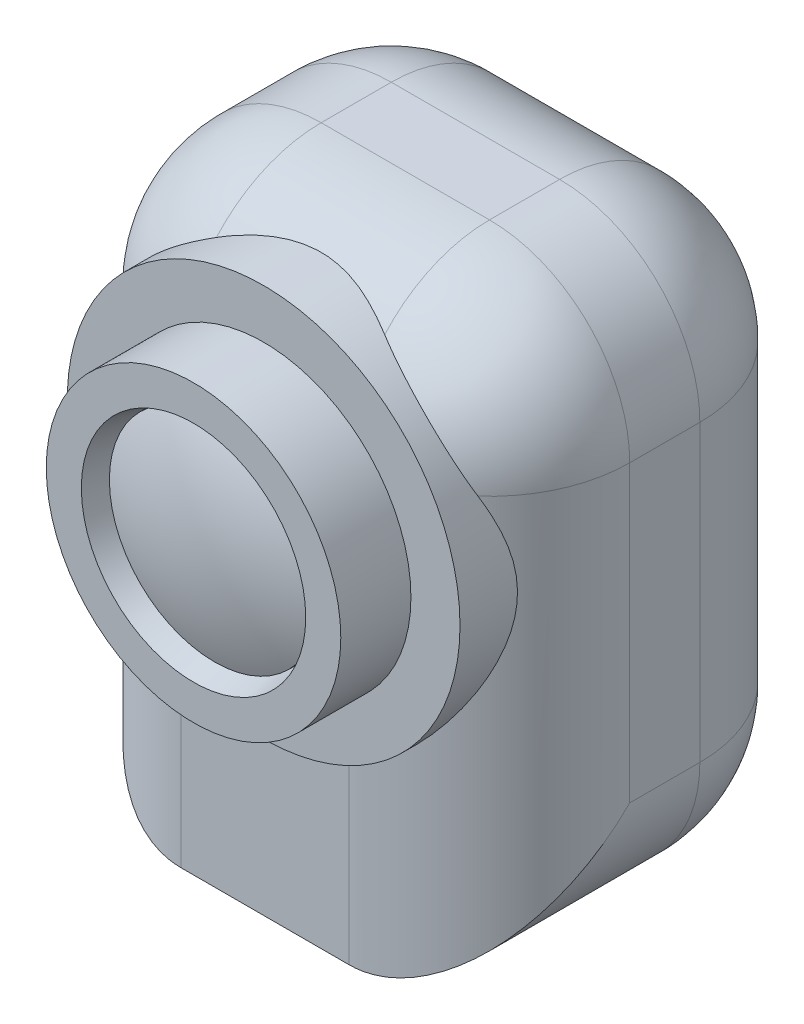
ISO-10303-21;
HEADER;
FILE_DESCRIPTION(('STEP AP214'),'2;1');
FILE_NAME('part.step','',(''),(''),'','','');
FILE_SCHEMA(('AUTOMOTIVE_DESIGN { 1 0 10303 214 1 1 1 1 }'));
ENDSEC;
DATA;
#1=APPLICATION_CONTEXT('core data for automotive mechanical design processes');
#2=APPLICATION_PROTOCOL_DEFINITION('international standard','automotive_design',2000,#1);
#3=PRODUCT_CONTEXT('',#1,'mechanical');
#4=PRODUCT('Part','Part','',(#3));
#5=PRODUCT_RELATED_PRODUCT_CATEGORY('part','',(#4));
#6=PRODUCT_DEFINITION_FORMATION('','',#4);
#7=PRODUCT_DEFINITION_CONTEXT('part definition',#1,'design');
#8=PRODUCT_DEFINITION('design','',#6,#7);
#9=PRODUCT_DEFINITION_SHAPE('','',#8);
#10=(LENGTH_UNIT() NAMED_UNIT(*) SI_UNIT(.MILLI.,.METRE.));
#11=(NAMED_UNIT(*) PLANE_ANGLE_UNIT() SI_UNIT($,.RADIAN.));
#12=(NAMED_UNIT(*) SI_UNIT($,.STERADIAN.) SOLID_ANGLE_UNIT());
#13=UNCERTAINTY_MEASURE_WITH_UNIT(LENGTH_MEASURE(1.E-05),#10,'distance_accuracy_value','');
#14=(GEOMETRIC_REPRESENTATION_CONTEXT(3) GLOBAL_UNCERTAINTY_ASSIGNED_CONTEXT((#13)) GLOBAL_UNIT_ASSIGNED_CONTEXT((#10,
#11,#12)) REPRESENTATION_CONTEXT('',''));
#15=CARTESIAN_POINT('',(0.,0.,0.));
#16=DIRECTION('',(0.,0.,1.));
#17=DIRECTION('',(1.,0.,0.));
#18=AXIS2_PLACEMENT_3D('',#15,#16,#17);
#19=CARTESIAN_POINT('',(6.00000000000001,10.5,25.));
#20=DIRECTION('',(0.,0.,-1.));
#21=DIRECTION('',(-1.,0.,0.));
#22=AXIS2_PLACEMENT_3D('',#19,#20,#21);
#23=CYLINDRICAL_SURFACE('',#22,10.);
#24=DIRECTION('',(0.,0.,-1.));
#25=VECTOR('',#24,1.);
#26=CARTESIAN_POINT('',(6.00000000000001,20.5,25.));
#27=LINE('',#26,#25);
#28=CARTESIAN_POINT('',(6.00000000000001,20.5,15.));
#29=VERTEX_POINT('',#28);
#30=CARTESIAN_POINT('',(6.00000000000001,20.5,10.));
#31=VERTEX_POINT('',#30);
#32=EDGE_CURVE('E163',#29,#31,#27,.T.);
#33=ORIENTED_EDGE('',*,*,#32,.F.);
#34=CARTESIAN_POINT('',(6.00000000000001,10.5,15.));
#35=DIRECTION('',(0.,0.,-1.));
#36=DIRECTION('',(-1.,0.,0.));
#37=AXIS2_PLACEMENT_3D('',#34,#35,#36);
#38=CIRCLE('',#37,10.);
#39=CARTESIAN_POINT('',(16.,10.5,15.));
#40=VERTEX_POINT('',#39);
#41=EDGE_CURVE('E171',#29,#40,#38,.T.);
#42=ORIENTED_EDGE('',*,*,#41,.T.);
#43=DIRECTION('',(0.,0.,-1.));
#44=VECTOR('',#43,1.);
#45=CARTESIAN_POINT('',(16.,10.5,25.));
#46=LINE('',#45,#44);
#47=CARTESIAN_POINT('',(16.,10.5,10.));
#48=VERTEX_POINT('',#47);
#49=EDGE_CURVE('E344',#48,#40,#46,.F.);
#50=ORIENTED_EDGE('',*,*,#49,.F.);
#51=CARTESIAN_POINT('',(6.00000000000001,10.5,10.));
#52=DIRECTION('',(0.,0.,-1.));
#53=DIRECTION('',(-1.,0.,0.));
#54=AXIS2_PLACEMENT_3D('',#51,#52,#53);
#55=CIRCLE('',#54,10.);
#56=EDGE_CURVE('E174',#48,#31,#55,.F.);
#57=ORIENTED_EDGE('',*,*,#56,.T.);
#58=EDGE_LOOP('',(#33,#42,#50,#57));
#59=FACE_BOUND('',#58,.T.);
#60=ADVANCED_FACE('F47',(#59),#23,.T.);
#61=CARTESIAN_POINT('',(-16.,10.5,15.));
#62=DIRECTION('',(-1.,0.,0.));
#63=DIRECTION('',(0.,0.,1.));
#64=AXIS2_PLACEMENT_3D('',#61,#62,#63);
#65=CYLINDRICAL_SURFACE('',#64,10.);
#66=DIRECTION('',(1.,0.,0.));
#67=VECTOR('',#66,1.);
#68=CARTESIAN_POINT('',(-16.,20.5,15.));
#69=LINE('',#68,#67);
#70=CARTESIAN_POINT('',(-6.00000000000001,20.5,15.));
#71=VERTEX_POINT('',#70);
#72=EDGE_CURVE('E149',#71,#29,#69,.T.);
#73=ORIENTED_EDGE('',*,*,#72,.F.);
#74=CARTESIAN_POINT('',(-6.00000000000001,10.5,15.));
#75=DIRECTION('',(-1.,0.,0.));
#76=DIRECTION('',(0.,0.,1.));
#77=AXIS2_PLACEMENT_3D('',#74,#75,#76);
#78=CIRCLE('',#77,10.);
#79=CARTESIAN_POINT('',(-6.,17.1491106406735,22.4692253740319));
#80=VERTEX_POINT('',#79);
#81=EDGE_CURVE('E155',#71,#80,#78,.F.);
#82=ORIENTED_EDGE('',*,*,#81,.T.);
#83=CARTESIAN_POINT('',(12.6491106406735,10.5,25.));
#84=CARTESIAN_POINT('',(12.5819775070831,10.6415359511314,25.0000012053087));
#85=CARTESIAN_POINT('',(12.5124774843393,10.7819116940451,24.9969948025066));
#86=CARTESIAN_POINT('',(12.3689272298204,11.0600390711722,24.985275311561));
#87=CARTESIAN_POINT('',(12.2948779636018,11.197791254149,24.9765634306137));
#88=CARTESIAN_POINT('',(12.0664350964351,11.6062140087648,24.9423747209328));
#89=CARTESIAN_POINT('',(11.9054830107801,11.8726054105054,24.9088423858445));
#90=CARTESIAN_POINT('',(11.5696491190118,12.3890518096388,24.8234053126047));
#91=CARTESIAN_POINT('',(11.3949380720178,12.639253104552,24.771704601193));
#92=CARTESIAN_POINT('',(11.0315015740835,13.1254361212596,24.6524488326415));
#93=CARTESIAN_POINT('',(10.8427687105674,13.3614102007652,24.5848853483553));
#94=CARTESIAN_POINT('',(10.4029140572626,13.8766502180073,24.4174925626099));
#95=CARTESIAN_POINT('',(10.1481693236949,14.1515798199408,24.3138297007021));
#96=CARTESIAN_POINT('',(9.62121287198035,14.6769735219367,24.0903478844526));
#97=CARTESIAN_POINT('',(9.34899803987987,14.9274332401907,23.9705260456426));
#98=CARTESIAN_POINT('',(8.78733134529288,15.4050199874261,23.7186039159714));
#99=CARTESIAN_POINT('',(8.49779251227552,15.6320103744544,23.5864394092957));
#100=CARTESIAN_POINT('',(7.90410249831759,16.0611128142713,23.3149545117627));
#101=CARTESIAN_POINT('',(7.59995233359184,16.2632265937495,23.1756346185145));
#102=CARTESIAN_POINT('',(6.9701564606256,16.647273374109,22.8911018847475));
#103=CARTESIAN_POINT('',(6.64416871786876,16.8285997895847,22.745828021803));
#104=CARTESIAN_POINT('',(5.97764017348709,17.1651982477438,22.4581587130773));
#105=CARTESIAN_POINT('',(5.63709562940439,17.3204635391189,22.3157640215417));
#106=CARTESIAN_POINT('',(4.94234931091017,17.603952476166,22.0407898500935));
#107=CARTESIAN_POINT('',(4.58818967629867,17.7322526844199,21.9081832936071));
#108=CARTESIAN_POINT('',(3.86521363069135,17.9611916935072,21.660261433321));
#109=CARTESIAN_POINT('',(3.4964071711105,18.0618489197318,21.5449346351349));
#110=CARTESIAN_POINT('',(2.87876827976868,18.2030739992253,21.377307715481));
#111=CARTESIAN_POINT('',(2.63401817894569,18.2522725415428,21.3171931259358));
#112=CARTESIAN_POINT('',(2.139319904602,18.3378569172291,21.2106903130793));
#113=CARTESIAN_POINT('',(1.88937260859962,18.3742448952842,21.1642997923547));
#114=CARTESIAN_POINT('',(1.38611470705026,18.433509122133,21.0878393196028));
#115=CARTESIAN_POINT('',(1.13281587947802,18.456424034062,21.0577226873641));
#116=CARTESIAN_POINT('',(0.62383199463903,18.4884178557767,21.015471467738));
#117=CARTESIAN_POINT('',(0.368147039869,18.4974973571388,21.0033361115054));
#118=CARTESIAN_POINT('',(-0.144469276252393,18.5016092194982,20.9978550282571));
#119=CARTESIAN_POINT('',(-0.401401797327416,18.4965905719335,21.0045775308022));
#120=CARTESIAN_POINT('',(-0.913436508966855,18.4725209661462,21.036497034347));
#121=CARTESIAN_POINT('',(-1.16853863443372,18.4534695113237,21.0616946891544));
#122=CARTESIAN_POINT('',(-1.67577282070971,18.4016896687043,21.1290365143109));
#123=CARTESIAN_POINT('',(-1.92789472488775,18.3689236281534,21.1712273264547));
#124=CARTESIAN_POINT('',(-2.42716971565426,18.2903137751445,21.2701666448878));
#125=CARTESIAN_POINT('',(-2.67432194240553,18.2444677201155,21.3269176473562));
#126=CARTESIAN_POINT('',(-3.27413225846635,18.1166145941949,21.480834037692));
#127=CARTESIAN_POINT('',(-3.62360738497659,18.0276465399163,21.5846370772118));
#128=CARTESIAN_POINT('',(-4.30964411885593,17.8249794162615,21.8093728614246));
#129=CARTESIAN_POINT('',(-4.64619849588586,17.7112667306419,21.9303150244436));
#130=CARTESIAN_POINT('',(-5.30711950872937,17.4599285280781,22.1827011363405));
#131=CARTESIAN_POINT('',(-5.63145624131304,17.3222484581463,22.3141686654523));
#132=CARTESIAN_POINT('',(-6.26726040841043,17.0237678383347,22.5815974802745));
#133=CARTESIAN_POINT('',(-6.57873013810523,16.8629714350091,22.7175579566892));
#134=CARTESIAN_POINT('',(-7.20712022183367,16.5081337506741,22.9972735683509));
#135=CARTESIAN_POINT('',(-7.52325311776818,16.3126796267049,23.1410087366379));
#136=CARTESIAN_POINT('',(-8.14070818227147,15.8959462780286,23.4230096571067));
#137=CARTESIAN_POINT('',(-8.44202805319166,15.6746630648203,23.5612745601502));
#138=CARTESIAN_POINT('',(-9.02818820441857,15.206642756616,23.827221506132));
#139=CARTESIAN_POINT('',(-9.31305865273262,14.959954727755,23.9549231210011));
#140=CARTESIAN_POINT('',(-9.86520142689998,14.4408869315454,24.1951694255672));
#141=CARTESIAN_POINT('',(-10.1324806994136,14.1685174103032,24.3077201168599));
#142=CARTESIAN_POINT('',(-10.5779149767695,13.6753191120137,24.4850586652443));
#143=CARTESIAN_POINT('',(-10.7606981968594,13.4603445639219,24.5545491295746));
#144=CARTESIAN_POINT('',(-11.1145178820276,13.0174963084976,24.6806597180377));
#145=CARTESIAN_POINT('',(-11.2855611080865,12.7896301656543,24.7372872939597));
#146=CARTESIAN_POINT('',(-11.6143846297706,12.3222438954928,24.8354614166516));
#147=CARTESIAN_POINT('',(-11.7721967103702,12.0827540147823,24.8770449503957));
#148=CARTESIAN_POINT('',(-12.0737560213172,11.5927540962489,24.9431885585117));
#149=CARTESIAN_POINT('',(-12.2175026929208,11.3422436212089,24.9677479568407));
#150=CARTESIAN_POINT('',(-12.4903363520019,10.8305575836608,24.9978359007743));
#151=CARTESIAN_POINT('',(-12.6193450796925,10.5693342674926,25.0032670413645));
#152=CARTESIAN_POINT('',(-12.8606402079788,10.0397289910709,24.9929118065105));
#153=CARTESIAN_POINT('',(-12.9729304686229,9.77134870018354,24.9771303372109));
#154=CARTESIAN_POINT('',(-13.181142055404,9.2268761473809,24.9224401284357));
#155=CARTESIAN_POINT('',(-13.2768559869909,8.95073035599404,24.8832623534175));
#156=CARTESIAN_POINT('',(-13.4065591553837,8.53550460035837,24.8061539371936));
#157=CARTESIAN_POINT('',(-13.4475084226327,8.39682103364528,24.7773649324157));
#158=CARTESIAN_POINT('',(-13.5247702455137,8.11957327814503,24.7135888676021));
#159=CARTESIAN_POINT('',(-13.5610823639439,7.98100910183577,24.6786012238848));
#160=CARTESIAN_POINT('',(-13.5950832703596,7.84271010887716,24.6404777077973));
#161=B_SPLINE_CURVE_WITH_KNOTS('',3,(#83,#84,#85,#86,#87,#88,#89,#90,#91,#92,#93,#94,#95,#96,
#97,#98,#99,#100,#101,#102,#103,#104,#105,#106,#107,#108,#109,#110,#111,#112,#113,#114,#115,
#116,#117,#118,#119,#120,#121,#122,#123,#124,#125,#126,#127,#128,#129,#130,#131,#132,#133,#134,
#135,#136,#137,#138,#139,#140,#141,#142,#143,#144,#145,#146,#147,#148,#149,#150,#151,#152,#153,
#154,#155,#156,#157,#158,#159,#160),.UNSPECIFIED.,.F.,.F.,(4,2,2,2,2,2,2,2,2,2,2,2,2,2,2,2,2,2,
2,2,2,2,2,2,2,2,2,2,2,2,2,2,2,2,2,2,2,2,4),(0.,0.469838730052268,0.939578081169993,
1.87722269435343,2.80465760442652,3.73258633645033,4.89751630020639,6.06265448645012,
7.23423378434583,8.40573171680123,9.60557382511414,10.8057262824072,12.002423655814,
13.1983214254729,13.9680437112944,14.7376370723684,15.5050110440127,16.2723522032542,
17.0424732543145,17.8126215601084,18.5848982867503,19.3573075000235,20.4813015513594,
21.6059156747092,22.7331238641729,23.8601301093567,25.0545163431693,26.2490872574704,
27.4413928063177,28.6332246595616,29.5043313499891,30.374932092342,31.2433776092616,
32.111857610915,32.9847537473576,33.8574480313248,34.7403761079049,35.182521331032,
35.6247082099603),.UNSPECIFIED.);
#162=CARTESIAN_POINT('',(6.00000000000001,17.1491106406735,22.4692253740319));
#163=VERTEX_POINT('',#162);
#164=EDGE_CURVE('E151',#163,#80,#161,.T.);
#165=ORIENTED_EDGE('',*,*,#164,.F.);
#166=CARTESIAN_POINT('',(6.00000000000001,10.5,15.));
#167=DIRECTION('',(-1.,0.,0.));
#168=DIRECTION('',(0.,0.,1.));
#169=AXIS2_PLACEMENT_3D('',#166,#167,#168);
#170=CIRCLE('',#169,10.);
#171=EDGE_CURVE('E145',#163,#29,#170,.T.);
#172=ORIENTED_EDGE('',*,*,#171,.T.);
#173=EDGE_LOOP('',(#73,#82,#165,#172));
#174=FACE_BOUND('',#173,.T.);
#175=ADVANCED_FACE('F147',(#174),#65,.T.);
#176=CARTESIAN_POINT('',(-6.00000000000001,10.5,25.));
#177=DIRECTION('',(0.,0.,1.));
#178=DIRECTION('',(1.,0.,0.));
#179=AXIS2_PLACEMENT_3D('',#176,#177,#178);
#180=CYLINDRICAL_SURFACE('',#179,10.);
#181=DIRECTION('',(0.,0.,1.));
#182=VECTOR('',#181,1.);
#183=CARTESIAN_POINT('',(-16.,10.5,25.));
#184=LINE('',#183,#182);
#185=CARTESIAN_POINT('',(-16.,10.5,15.));
#186=VERTEX_POINT('',#185);
#187=CARTESIAN_POINT('',(-16.,10.5,10.));
#188=VERTEX_POINT('',#187);
#189=EDGE_CURVE('E356',#186,#188,#184,.F.);
#190=ORIENTED_EDGE('',*,*,#189,.F.);
#191=CARTESIAN_POINT('',(-6.00000000000001,10.5,15.));
#192=DIRECTION('',(0.,0.,1.));
#193=DIRECTION('',(1.,0.,0.));
#194=AXIS2_PLACEMENT_3D('',#191,#192,#193);
#195=CIRCLE('',#194,10.);
#196=EDGE_CURVE('E189',#186,#71,#195,.F.);
#197=ORIENTED_EDGE('',*,*,#196,.T.);
#198=DIRECTION('',(0.,0.,1.));
#199=VECTOR('',#198,1.);
#200=CARTESIAN_POINT('',(-6.00000000000001,20.5,25.));
#201=LINE('',#200,#199);
#202=CARTESIAN_POINT('',(-6.00000000000001,20.5,10.));
#203=VERTEX_POINT('',#202);
#204=EDGE_CURVE('E166',#203,#71,#201,.T.);
#205=ORIENTED_EDGE('',*,*,#204,.F.);
#206=CARTESIAN_POINT('',(-6.00000000000001,10.5,10.));
#207=DIRECTION('',(0.,0.,1.));
#208=DIRECTION('',(1.,0.,0.));
#209=AXIS2_PLACEMENT_3D('',#206,#207,#208);
#210=CIRCLE('',#209,10.);
#211=EDGE_CURVE('E349',#203,#188,#210,.T.);
#212=ORIENTED_EDGE('',*,*,#211,.T.);
#213=EDGE_LOOP('',(#190,#197,#205,#212));
#214=FACE_BOUND('',#213,.T.);
#215=ADVANCED_FACE('F325',(#214),#180,.T.);
#216=CARTESIAN_POINT('',(-16.,10.5,10.));
#217=DIRECTION('',(-1.,0.,0.));
#218=DIRECTION('',(0.,0.,1.));
#219=AXIS2_PLACEMENT_3D('',#216,#217,#218);
#220=CYLINDRICAL_SURFACE('',#219,10.);
#221=DIRECTION('',(-1.,0.,0.));
#222=VECTOR('',#221,1.);
#223=CARTESIAN_POINT('',(-16.,20.5,10.));
#224=LINE('',#223,#222);
#225=EDGE_CURVE('E439',#31,#203,#224,.T.);
#226=ORIENTED_EDGE('',*,*,#225,.F.);
#227=CARTESIAN_POINT('',(6.00000000000001,10.5,10.));
#228=DIRECTION('',(-1.,0.,0.));
#229=DIRECTION('',(0.,0.,1.));
#230=AXIS2_PLACEMENT_3D('',#227,#228,#229);
#231=CIRCLE('',#230,10.);
#232=CARTESIAN_POINT('',(6.,10.5,0.));
#233=VERTEX_POINT('',#232);
#234=EDGE_CURVE('E187',#31,#233,#231,.T.);
#235=ORIENTED_EDGE('',*,*,#234,.T.);
#236=DIRECTION('',(-1.,0.,0.));
#237=VECTOR('',#236,1.);
#238=CARTESIAN_POINT('',(0.,10.5,0.));
#239=LINE('',#238,#237);
#240=CARTESIAN_POINT('',(-6.00000000000001,10.5,0.));
#241=VERTEX_POINT('',#240);
#242=EDGE_CURVE('E442',#241,#233,#239,.F.);
#243=ORIENTED_EDGE('',*,*,#242,.F.);
#244=CARTESIAN_POINT('',(-6.00000000000001,10.5,10.));
#245=DIRECTION('',(-1.,0.,0.));
#246=DIRECTION('',(0.,0.,1.));
#247=AXIS2_PLACEMENT_3D('',#244,#245,#246);
#248=CIRCLE('',#247,10.);
#249=EDGE_CURVE('E183',#241,#203,#248,.F.);
#250=ORIENTED_EDGE('',*,*,#249,.T.);
#251=EDGE_LOOP('',(#226,#235,#243,#250));
#252=FACE_BOUND('',#251,.T.);
#253=ADVANCED_FACE('F330',(#252),#220,.T.);
#254=CARTESIAN_POINT('',(16.,20.5,25.));
#255=DIRECTION('',(-1.,0.,0.));
#256=DIRECTION('',(0.,-1.,0.));
#257=AXIS2_PLACEMENT_3D('',#254,#255,#256);
#258=PLANE('',#257);
#259=ORIENTED_EDGE('',*,*,#49,.T.);
#260=DIRECTION('',(0.,1.,0.));
#261=VECTOR('',#260,1.);
#262=CARTESIAN_POINT('',(16.,-20.5,15.));
#263=LINE('',#262,#261);
#264=CARTESIAN_POINT('',(16.,-10.5,15.));
#265=VERTEX_POINT('',#264);
#266=EDGE_CURVE('E225',#40,#265,#263,.F.);
#267=ORIENTED_EDGE('',*,*,#266,.T.);
#268=DIRECTION('',(0.,0.,-1.));
#269=VECTOR('',#268,1.);
#270=CARTESIAN_POINT('',(16.,-10.5,25.));
#271=LINE('',#270,#269);
#272=CARTESIAN_POINT('',(16.,-10.5,10.));
#273=VERTEX_POINT('',#272);
#274=EDGE_CURVE('E222',#265,#273,#271,.T.);
#275=ORIENTED_EDGE('',*,*,#274,.T.);
#276=DIRECTION('',(0.,1.,0.));
#277=VECTOR('',#276,1.);
#278=CARTESIAN_POINT('',(16.,20.5,10.));
#279=LINE('',#278,#277);
#280=EDGE_CURVE('E219',#273,#48,#279,.T.);
#281=ORIENTED_EDGE('',*,*,#280,.T.);
#282=EDGE_LOOP('',(#259,#267,#275,#281));
#283=FACE_BOUND('',#282,.T.);
#284=ADVANCED_FACE('F450',(#283),#258,.F.);
#285=CARTESIAN_POINT('',(-16.,20.5,25.));
#286=DIRECTION('',(0.,-1.,0.));
#287=DIRECTION('',(0.,0.,-1.));
#288=AXIS2_PLACEMENT_3D('',#285,#286,#287);
#289=PLANE('',#288);
#290=ORIENTED_EDGE('',*,*,#32,.T.);
#291=ORIENTED_EDGE('',*,*,#225,.T.);
#292=ORIENTED_EDGE('',*,*,#204,.T.);
#293=ORIENTED_EDGE('',*,*,#72,.T.);
#294=EDGE_LOOP('',(#290,#291,#292,#293));
#295=FACE_BOUND('',#294,.T.);
#296=ADVANCED_FACE('F161',(#295),#289,.F.);
#297=CARTESIAN_POINT('',(-16.,20.5,25.));
#298=DIRECTION('',(1.,0.,0.));
#299=DIRECTION('',(0.,1.,0.));
#300=AXIS2_PLACEMENT_3D('',#297,#298,#299);
#301=PLANE('',#300);
#302=DIRECTION('',(0.,0.,-1.));
#303=VECTOR('',#302,1.);
#304=CARTESIAN_POINT('',(-16.,-10.5,25.));
#305=LINE('',#304,#303);
#306=CARTESIAN_POINT('',(-16.,-10.5,10.));
#307=VERTEX_POINT('',#306);
#308=CARTESIAN_POINT('',(-16.,-10.5,15.));
#309=VERTEX_POINT('',#308);
#310=EDGE_CURVE('E207',#307,#309,#305,.F.);
#311=ORIENTED_EDGE('',*,*,#310,.T.);
#312=DIRECTION('',(0.,-1.,0.));
#313=VECTOR('',#312,1.);
#314=CARTESIAN_POINT('',(-16.,10.5,15.));
#315=LINE('',#314,#313);
#316=EDGE_CURVE('E210',#309,#186,#315,.F.);
#317=ORIENTED_EDGE('',*,*,#316,.T.);
#318=ORIENTED_EDGE('',*,*,#189,.T.);
#319=DIRECTION('',(0.,-1.,0.));
#320=VECTOR('',#319,1.);
#321=CARTESIAN_POINT('',(-16.,20.5,10.));
#322=LINE('',#321,#320);
#323=EDGE_CURVE('E204',#188,#307,#322,.T.);
#324=ORIENTED_EDGE('',*,*,#323,.T.);
#325=EDGE_LOOP('',(#311,#317,#318,#324));
#326=FACE_BOUND('',#325,.T.);
#327=ADVANCED_FACE('F468',(#326),#301,.F.);
#328=CARTESIAN_POINT('',(-16.,-20.5,25.));
#329=DIRECTION('',(0.,1.,0.));
#330=DIRECTION('',(0.,0.,1.));
#331=AXIS2_PLACEMENT_3D('',#328,#329,#330);
#332=PLANE('',#331);
#333=DIRECTION('',(1.,0.,0.));
#334=VECTOR('',#333,1.);
#335=CARTESIAN_POINT('',(-16.,-20.5,25.));
#336=LINE('',#335,#334);
#337=CARTESIAN_POINT('',(-6.,-20.5,25.));
#338=VERTEX_POINT('',#337);
#339=CARTESIAN_POINT('',(6.00000000000001,-20.5,25.));
#340=VERTEX_POINT('',#339);
#341=EDGE_CURVE('E413',#338,#340,#336,.T.);
#342=ORIENTED_EDGE('',*,*,#341,.F.);
#343=DIRECTION('',(0.,0.,-1.));
#344=VECTOR('',#343,1.);
#345=CARTESIAN_POINT('',(-6.,-20.5,25.));
#346=LINE('',#345,#344);
#347=CARTESIAN_POINT('',(-6.,-20.5,10.));
#348=VERTEX_POINT('',#347);
#349=EDGE_CURVE('E201',#338,#348,#346,.T.);
#350=ORIENTED_EDGE('',*,*,#349,.T.);
#351=DIRECTION('',(1.,0.,0.));
#352=VECTOR('',#351,1.);
#353=CARTESIAN_POINT('',(-16.,-20.5,10.));
#354=LINE('',#353,#352);
#355=CARTESIAN_POINT('',(6.00000000000001,-20.5,10.));
#356=VERTEX_POINT('',#355);
#357=EDGE_CURVE('E195',#348,#356,#354,.T.);
#358=ORIENTED_EDGE('',*,*,#357,.T.);
#359=DIRECTION('',(0.,0.,-1.));
#360=VECTOR('',#359,1.);
#361=CARTESIAN_POINT('',(6.00000000000001,-20.5,25.));
#362=LINE('',#361,#360);
#363=EDGE_CURVE('E198',#356,#340,#362,.F.);
#364=ORIENTED_EDGE('',*,*,#363,.T.);
#365=EDGE_LOOP('',(#342,#350,#358,#364));
#366=FACE_BOUND('',#365,.T.);
#367=ADVANCED_FACE('F474',(#366),#332,.F.);
#368=CARTESIAN_POINT('',(0.,0.,25.));
#369=DIRECTION('',(0.,0.,1.));
#370=DIRECTION('',(1.,0.,0.));
#371=AXIS2_PLACEMENT_3D('',#368,#369,#370);
#372=PLANE('',#371);
#373=CARTESIAN_POINT('',(0.,4.5,25.));
#374=DIRECTION('',(0.,0.,1.));
#375=DIRECTION('',(1.,0.,0.));
#376=AXIS2_PLACEMENT_3D('',#373,#374,#375);
#377=CIRCLE('',#376,14.);
#378=CARTESIAN_POINT('',(-6.,-8.14911064067352,25.));
#379=VERTEX_POINT('',#378);
#380=CARTESIAN_POINT('',(6.00000000000001,-8.14911064067352,25.));
#381=VERTEX_POINT('',#380);
#382=EDGE_CURVE('E420',#379,#381,#377,.T.);
#383=ORIENTED_EDGE('',*,*,#382,.F.);
#384=DIRECTION('',(0.,-1.,0.));
#385=VECTOR('',#384,1.);
#386=CARTESIAN_POINT('',(-6.,-20.5,25.));
#387=LINE('',#386,#385);
#388=EDGE_CURVE('E216',#379,#338,#387,.T.);
#389=ORIENTED_EDGE('',*,*,#388,.T.);
#390=ORIENTED_EDGE('',*,*,#341,.T.);
#391=DIRECTION('',(0.,1.,0.));
#392=VECTOR('',#391,1.);
#393=CARTESIAN_POINT('',(6.,10.5,25.));
#394=LINE('',#393,#392);
#395=EDGE_CURVE('E213',#340,#381,#394,.T.);
#396=ORIENTED_EDGE('',*,*,#395,.T.);
#397=EDGE_LOOP('',(#383,#389,#390,#396));
#398=FACE_BOUND('',#397,.T.);
#399=ADVANCED_FACE('F478',(#398),#372,.T.);
#400=CARTESIAN_POINT('',(0.,0.,0.));
#401=DIRECTION('',(0.,0.,1.));
#402=DIRECTION('',(1.,0.,0.));
#403=AXIS2_PLACEMENT_3D('',#400,#401,#402);
#404=PLANE('',#403);
#405=ORIENTED_EDGE('',*,*,#242,.T.);
#406=DIRECTION('',(0.,1.,0.));
#407=VECTOR('',#406,1.);
#408=CARTESIAN_POINT('',(6.00000000000001,0.,0.));
#409=LINE('',#408,#407);
#410=CARTESIAN_POINT('',(6.00000000000001,-10.5,0.));
#411=VERTEX_POINT('',#410);
#412=EDGE_CURVE('E234',#233,#411,#409,.F.);
#413=ORIENTED_EDGE('',*,*,#412,.T.);
#414=DIRECTION('',(1.,0.,0.));
#415=VECTOR('',#414,1.);
#416=CARTESIAN_POINT('',(0.,-10.5,0.));
#417=LINE('',#416,#415);
#418=CARTESIAN_POINT('',(-6.,-10.5,0.));
#419=VERTEX_POINT('',#418);
#420=EDGE_CURVE('E231',#411,#419,#417,.F.);
#421=ORIENTED_EDGE('',*,*,#420,.T.);
#422=DIRECTION('',(0.,-1.,0.));
#423=VECTOR('',#422,1.);
#424=CARTESIAN_POINT('',(-6.,0.,0.));
#425=LINE('',#424,#423);
#426=EDGE_CURVE('E228',#419,#241,#425,.F.);
#427=ORIENTED_EDGE('',*,*,#426,.T.);
#428=EDGE_LOOP('',(#405,#413,#421,#427));
#429=FACE_BOUND('',#428,.T.);
#430=ADVANCED_FACE('F458',(#429),#404,.F.);
#431=CARTESIAN_POINT('',(0.,4.5,25.1));
#432=DIRECTION('',(0.,0.,-1.));
#433=DIRECTION('',(-1.,0.,0.));
#434=AXIS2_PLACEMENT_3D('',#431,#432,#433);
#435=CYLINDRICAL_SURFACE('',#434,14.);
#436=CARTESIAN_POINT('',(0.,4.5,25.1));
#437=DIRECTION('',(0.,0.,1.));
#438=DIRECTION('',(1.,0.,0.));
#439=AXIS2_PLACEMENT_3D('',#436,#437,#438);
#440=CIRCLE('',#439,14.);
#441=CARTESIAN_POINT('',(14.,4.5,25.1));
#442=VERTEX_POINT('',#441);
#443=EDGE_CURVE('E407',#442,#442,#440,.T.);
#444=ORIENTED_EDGE('',*,*,#443,.F.);
#445=EDGE_LOOP('',(#444));
#446=FACE_BOUND('',#445,.T.);
#447=CARTESIAN_POINT('',(-6.00000000000001,17.1491106406735,22.4692253740319));
#448=CARTESIAN_POINT('',(-6.11751530498532,17.0933699548473,22.5188455895599));
#449=CARTESIAN_POINT('',(-6.2349699179028,17.0356479547151,22.5663375622114));
#450=CARTESIAN_POINT('',(-6.46949747332242,16.91623590814,22.6570796001444));
#451=CARTESIAN_POINT('',(-6.58657042150594,16.8545459210497,22.7003297288505));
#452=CARTESIAN_POINT('',(-6.93679091503989,16.6635354675802,22.8237270019584));
#453=CARTESIAN_POINT('',(-7.16898126584228,16.5282550770127,22.8975383244225));
#454=CARTESIAN_POINT('',(-7.62816116584201,16.242411214,23.0281456284669));
#455=CARTESIAN_POINT('',(-7.85515773459423,16.0918700707664,23.084966003098));
#456=CARTESIAN_POINT('',(-8.30230242356854,15.7759343983714,23.1817592701392));
#457=CARTESIAN_POINT('',(-8.52245085537366,15.6105405463275,23.2217329300985));
#458=CARTESIAN_POINT('',(-8.95431811556948,15.2655319183814,23.2848776988963));
#459=CARTESIAN_POINT('',(-9.16602538662598,15.0858985876603,23.3080264711525));
#460=CARTESIAN_POINT('',(-9.5790024291568,14.7137151632141,23.3374353011774));
#461=CARTESIAN_POINT('',(-9.78027225430706,14.5211651359266,23.3436954458067));
#462=CARTESIAN_POINT('',(-10.170848410626,14.1245159215898,23.3393271022462));
#463=CARTESIAN_POINT('',(-10.3601560516381,13.9204180036742,23.3287004664801));
#464=CARTESIAN_POINT('',(-10.7255372360282,13.5022185768881,23.2905629600118));
#465=CARTESIAN_POINT('',(-10.9016116450591,13.2881177238487,23.2630531948018));
#466=CARTESIAN_POINT('',(-11.2284271483103,12.8659403207009,23.1935056821968));
#467=CARTESIAN_POINT('',(-11.3800719632757,12.6583857194207,23.1525358890016));
#468=CARTESIAN_POINT('',(-11.6702414588236,12.2376216768503,23.0558477340996));
#469=CARTESIAN_POINT('',(-11.8087664331247,12.024412362291,23.000129702673));
#470=CARTESIAN_POINT('',(-12.0723527457278,11.59380047882,22.8738732134841));
#471=CARTESIAN_POINT('',(-12.1974010015533,11.3763940726877,22.8033205476121));
#472=CARTESIAN_POINT('',(-12.4336754555196,10.9393887649537,22.6473953925924));
#473=CARTESIAN_POINT('',(-12.5449013574256,10.7197898164712,22.5620225859197));
#474=CARTESIAN_POINT('',(-12.6491106406735,10.5,22.4692253740319));
#475=B_SPLINE_CURVE_WITH_KNOTS('',3,(#447,#448,#449,#450,#451,#452,#453,#454,#455,#456,#457,
#458,#459,#460,#461,#462,#463,#464,#465,#466,#467,#468,#469,#470,#471,#472,#473,#474),
.UNSPECIFIED.,.F.,.F.,(4,2,2,2,2,2,2,2,2,2,2,2,2,4),(0.,0.417562344426956,0.83511844446738,
1.67008504541985,2.50384710722665,3.33757117808351,4.17240008240683,5.00722469308603,
5.84195773260019,6.67663612037714,7.45671915109455,8.23678471367942,9.01760082782159,
9.79843367319206),.UNSPECIFIED.);
#476=CARTESIAN_POINT('',(-12.6491106406735,10.5,22.4692253740319));
#477=VERTEX_POINT('',#476);
#478=EDGE_CURVE('E71',#80,#477,#475,.T.);
#479=ORIENTED_EDGE('',*,*,#478,.T.);
#480=CARTESIAN_POINT('',(-12.6491106406735,10.5,22.4692253740319));
#481=CARTESIAN_POINT('',(-12.7169391253658,10.3569968208438,22.4088471154395));
#482=CARTESIAN_POINT('',(-12.7824147564084,10.2127077861554,22.3489011696463));
#483=CARTESIAN_POINT('',(-12.908627035472,9.92149050813837,22.2303777788694));
#484=CARTESIAN_POINT('',(-12.9693629711365,9.77456187215547,22.1718005405202));
#485=CARTESIAN_POINT('',(-13.1446782371059,9.32902694087361,21.9986122086813));
#486=CARTESIAN_POINT('',(-13.2520198539298,9.02639779672769,21.8868565502295));
#487=CARTESIAN_POINT('',(-13.4478947728615,8.40654806893883,21.6745782387262));
#488=CARTESIAN_POINT('',(-13.5361726763254,8.08919123562769,21.5742157602346));
#489=CARTESIAN_POINT('',(-13.6909447304602,7.44411406326898,21.3924682947861));
#490=CARTESIAN_POINT('',(-13.7574632937264,7.11640579385286,21.3110620698825));
#491=CARTESIAN_POINT('',(-13.8522887401501,6.54300405268908,21.1923862691866));
#492=CARTESIAN_POINT('',(-13.886071853406,6.2994514311067,21.149134954084));
#493=CARTESIAN_POINT('',(-13.9408906049957,5.80862841727201,21.0781811619719));
#494=CARTESIAN_POINT('',(-13.9619268980463,5.56135821663498,21.0504778863715));
#495=CARTESIAN_POINT('',(-13.990721994132,5.06634652809614,21.0123987689923));
#496=CARTESIAN_POINT('',(-13.9985676892794,4.81861897269033,21.001909541936));
#497=CARTESIAN_POINT('',(-14.001074279403,4.32297772780055,20.998567818318));
#498=CARTESIAN_POINT('',(-13.9957352397026,4.07506403924486,21.0057152343761));
#499=CARTESIAN_POINT('',(-13.9719988916514,3.58111767601759,21.0371858579987));
#500=CARTESIAN_POINT('',(-13.9536091349654,3.33508399667526,21.0614991326716));
#501=CARTESIAN_POINT('',(-13.9041745277065,2.84642537695607,21.1258179361634));
#502=CARTESIAN_POINT('',(-13.8731290721672,2.60380060010486,21.1658242151343));
#503=CARTESIAN_POINT('',(-13.7614878862267,1.88092315101605,21.3066421886775));
#504=CARTESIAN_POINT('',(-13.6624766583299,1.40741291282277,21.4281165849787));
#505=CARTESIAN_POINT('',(-13.442243181703,0.568231873999861,21.680988725666));
#506=CARTESIAN_POINT('',(-13.3283967104538,0.198678661250882,21.8065067456109));
#507=CARTESIAN_POINT('',(-13.0725714887613,-0.52546149356418,22.0719699348694));
#508=CARTESIAN_POINT('',(-12.9305751455568,-0.880038907280122,22.2119240999362));
#509=CARTESIAN_POINT('',(-12.6190062375349,-1.57504260378184,22.4989169624209));
#510=CARTESIAN_POINT('',(-12.4493633611325,-1.91542995087693,22.6459730324395));
#511=CARTESIAN_POINT('',(-12.0831334740756,-2.58111031182627,22.9404480805043));
#512=CARTESIAN_POINT('',(-11.8865524381587,-2.90640665142872,23.0878669709787));
#513=CARTESIAN_POINT('',(-11.4565169860221,-3.55649833291418,23.3843800579281));
#514=CARTESIAN_POINT('',(-11.2217627236533,-3.88054978095453,23.533226652644));
#515=CARTESIAN_POINT('',(-10.7224711662568,-4.51055711203683,23.8193585255508));
#516=CARTESIAN_POINT('',(-10.4579264612978,-4.81650846395379,23.9566409124071));
#517=CARTESIAN_POINT('',(-9.90085897893346,-5.40639093415294,24.2128585015277));
#518=CARTESIAN_POINT('',(-9.6085134095315,-5.69044305117266,24.3318987460663));
#519=CARTESIAN_POINT('',(-8.9952664908459,-6.23560229528869,24.5463980853656));
#520=CARTESIAN_POINT('',(-8.67438710459607,-6.49672676775565,24.6418751070981));
#521=CARTESIAN_POINT('',(-8.15992201408585,-6.87831815539793,24.7657128358197));
#522=CARTESIAN_POINT('',(-7.97576917448112,-7.00818028762881,24.8047330016351));
#523=CARTESIAN_POINT('',(-7.60019342437547,-7.25959547938636,24.8729826052777));
#524=CARTESIAN_POINT('',(-7.40877356565285,-7.38115196810862,24.9022161034585));
#525=CARTESIAN_POINT('',(-7.01796212418447,-7.61612493774441,24.950011862684));
#526=CARTESIAN_POINT('',(-6.81852668168009,-7.72948314028324,24.9685032612265));
#527=CARTESIAN_POINT('',(-6.41356857194503,-7.94665220470792,24.9935091989737));
#528=CARTESIAN_POINT('',(-6.20804052010275,-8.05045426693732,25.000012802123));
#529=CARTESIAN_POINT('',(-6.,-8.14911064067351,25.));
#530=B_SPLINE_CURVE_WITH_KNOTS('',3,(#480,#481,#482,#483,#484,#485,#486,#487,#488,#489,#490,
#491,#492,#493,#494,#495,#496,#497,#498,#499,#500,#501,#502,#503,#504,#505,#506,#507,#508,#509,
#510,#511,#512,#513,#514,#515,#516,#517,#518,#519,#520,#521,#522,#523,#524,#525,#526,#527,#528,
#529),.UNSPECIFIED.,.F.,.F.,(4,2,2,2,2,2,2,2,2,2,2,2,2,2,2,2,2,2,2,2,2,2,2,2,4),(0.,
0.508151868983015,1.01637996456661,2.03541834482911,3.06736159191784,4.09814306141558,
4.84638607926165,5.59459066172586,6.33784690538261,7.08109946660482,7.823922302574,
8.56678065104967,10.0576982808222,11.2758960086988,12.4948574846795,13.7169688818128,
14.938809658673,16.2181463921557,17.4978020475172,18.7697873291606,20.0408018764233,
20.7264700890411,21.4118534737943,22.1017082438303,22.7921920338828),.UNSPECIFIED.);
#531=EDGE_CURVE('E58',#477,#379,#530,.T.);
#532=ORIENTED_EDGE('',*,*,#531,.T.);
#533=ORIENTED_EDGE('',*,*,#382,.T.);
#534=CARTESIAN_POINT('',(6.00000000000001,-8.14911064067352,25.));
#535=CARTESIAN_POINT('',(6.14153354956643,-8.08197864610117,25.000001205284));
#536=CARTESIAN_POINT('',(6.2819069313709,-8.0124798422925,24.9969949045105));
#537=CARTESIAN_POINT('',(6.56002968054254,-7.86893217675645,24.9852758058999));
#538=CARTESIAN_POINT('',(6.69777959664601,-7.79488428054024,24.9765642152024));
#539=CARTESIAN_POINT('',(7.10619574093656,-7.5664457197924,24.9423766315729));
#540=CARTESIAN_POINT('',(7.37258295607944,-7.40549678286342,24.9088453878198));
#541=CARTESIAN_POINT('',(7.88903026535455,-7.06966394994103,24.8234095821859));
#542=CARTESIAN_POINT('',(8.13923620255079,-6.89495028410169,24.7717084152233));
#543=CARTESIAN_POINT('',(8.62542803435096,-6.53150804221965,24.6524511483025));
#544=CARTESIAN_POINT('',(8.86140628588126,-6.34277205282283,24.5848866203034));
#545=CARTESIAN_POINT('',(9.37665881398078,-5.90290671877175,24.4174897698375));
#546=CARTESIAN_POINT('',(9.6515963020479,-5.64815405122935,24.3138234861875));
#547=CARTESIAN_POINT('',(10.1770043004829,-5.12118074222511,24.0903339957129));
#548=CARTESIAN_POINT('',(10.4274704281878,-4.84895698621554,23.9705079038842));
#549=CARTESIAN_POINT('',(10.9050542364397,-4.28728836993263,23.7185843674224));
#550=CARTESIAN_POINT('',(11.1320367547778,-3.99775748158877,23.5864234039478));
#551=CARTESIAN_POINT('',(11.5611249076623,-3.4040842979052,23.3149461756154));
#552=CARTESIAN_POINT('',(11.763232273398,-3.09994302142781,23.1756304096545));
#553=CARTESIAN_POINT('',(12.1472489276866,-2.47019654825812,22.8911199975647));
#554=CARTESIAN_POINT('',(12.3285541577211,-2.1442507423689,22.7458645835912));
#555=CARTESIAN_POINT('',(12.6651168535944,-1.47780968367874,22.4582307107351));
#556=CARTESIAN_POINT('',(12.8203675654992,-1.13731068696584,22.3158530062085));
#557=CARTESIAN_POINT('',(13.1038699101775,-0.442571736975103,22.0408740265617));
#558=CARTESIAN_POINT('',(13.2321914238818,-0.0883702462940757,21.9082480424478));
#559=CARTESIAN_POINT('',(13.4611662899139,0.634693283488241,21.6602905335871));
#560=CARTESIAN_POINT('',(13.5618380675069,1.0035453711834,21.5449475152018));
#561=CARTESIAN_POINT('',(13.7031013705164,1.62135142437773,21.3772752277861));
#562=CARTESIAN_POINT('',(13.7523212499131,1.86622411666021,21.3171336102868));
#563=CARTESIAN_POINT('',(13.8379353357231,2.36117265759384,21.21059162603));
#564=CARTESIAN_POINT('',(13.8743316787969,2.61124763207881,21.1641889702895));
#565=CARTESIAN_POINT('',(13.9335695099274,3.114514656381,21.0877602572924));
#566=CARTESIAN_POINT('',(13.9564628889098,3.3676909058607,21.0576715432219));
#567=CARTESIAN_POINT('',(13.9884269590367,3.8764243062704,21.0154592742318));
#568=CARTESIAN_POINT('',(13.997498358753,4.13198133447607,21.0033347983921));
#569=CARTESIAN_POINT('',(14.0016053211785,4.64397976861931,20.9978602026094));
#570=CARTESIAN_POINT('',(13.9966097875056,4.90042188029153,21.0045516771859));
#571=CARTESIAN_POINT('',(13.9726389233499,5.41149524841299,21.0363409645233));
#572=CARTESIAN_POINT('',(13.9536626693866,5.66612638411845,21.0614399931734));
#573=CARTESIAN_POINT('',(13.9019841754175,6.17340561081204,21.1286569283602));
#574=CARTESIAN_POINT('',(13.8691921492836,6.42602951355423,21.1708860924627));
#575=CARTESIAN_POINT('',(13.7904804340633,6.92627017574174,21.269960124613));
#576=CARTESIAN_POINT('',(13.7445600732093,7.17388667826754,21.3268057405593));
#577=CARTESIAN_POINT('',(13.6340839203125,7.69217887393318,21.4598043470001));
#578=CARTESIAN_POINT('',(13.5679706389072,7.96213721735981,21.5374425038315));
#579=CARTESIAN_POINT('',(13.4208906907621,8.49449500810182,21.7039334081001));
#580=CARTESIAN_POINT('',(13.3399183321863,8.75689151410373,21.792790448898));
#581=CARTESIAN_POINT('',(13.1649307130573,9.27045523582598,21.9770809436075));
#582=CARTESIAN_POINT('',(13.0711077835148,9.52172662922346,22.0724085404708));
#583=CARTESIAN_POINT('',(12.870071991529,10.0165461162877,22.267867124295));
#584=CARTESIAN_POINT('',(12.7628755707593,10.2601032407967,22.3679921216923));
#585=CARTESIAN_POINT('',(12.6491106406736,10.5,22.469225374032));
#586=B_SPLINE_CURVE_WITH_KNOTS('',3,(#534,#535,#536,#537,#538,#539,#540,#541,#542,#543,#544,
#545,#546,#547,#548,#549,#550,#551,#552,#553,#554,#555,#556,#557,#558,#559,#560,#561,#562,#563,
#564,#565,#566,#567,#568,#569,#570,#571,#572,#573,#574,#575,#576,#577,#578,#579,#580,#581,#582,
#583,#584,#585),.UNSPECIFIED.,.F.,.F.,(4,2,2,2,2,2,2,2,2,2,2,2,2,2,2,2,2,2,2,2,2,2,2,2,2,4),(0.,
0.469830762829615,0.939562149773962,1.87719094497899,2.80464170455432,3.7325863286812,
4.8975511962015,6.06272432044134,7.23426879922155,8.40573169805751,9.60542289606236,
10.8054246030228,12.0022727251118,13.1983213442269,13.9684244673068,14.7383992148832,
15.5053953934092,16.2723522512195,17.0410058750413,17.8097102759486,18.5834893367292,
19.3573079983237,20.2222295629835,21.0874831339446,21.9409709081393,22.7934195386615),.UNSPECIFIED.);
#587=CARTESIAN_POINT('',(12.6491106406735,10.5,22.4692253740319));
#588=VERTEX_POINT('',#587);
#589=EDGE_CURVE('E11',#381,#588,#586,.T.);
#590=ORIENTED_EDGE('',*,*,#589,.T.);
#591=CARTESIAN_POINT('',(12.6491106406735,10.5,22.4692253740319));
#592=CARTESIAN_POINT('',(12.5933699548473,10.6175153049853,22.5188455895599));
#593=CARTESIAN_POINT('',(12.5356479547151,10.7349699179028,22.5663375622113));
#594=CARTESIAN_POINT('',(12.41623590814,10.9694974733224,22.6570796001444));
#595=CARTESIAN_POINT('',(12.3545459210497,11.0865704215059,22.7003297288505));
#596=CARTESIAN_POINT('',(12.1635354675803,11.4367909150399,22.8237270019583));
#597=CARTESIAN_POINT('',(12.0282550770128,11.6689812658423,22.8975383244225));
#598=CARTESIAN_POINT('',(11.742411214,12.128161165842,23.0281456284669));
#599=CARTESIAN_POINT('',(11.5918700707664,12.3551577345942,23.084966003098));
#600=CARTESIAN_POINT('',(11.2759343983714,12.8023024235685,23.1817592701392));
#601=CARTESIAN_POINT('',(11.1105405463275,13.0224508553737,23.2217329300985));
#602=CARTESIAN_POINT('',(10.7655319183814,13.4543181155695,23.2848776988963));
#603=CARTESIAN_POINT('',(10.5858985876603,13.666025386626,23.3080264711524));
#604=CARTESIAN_POINT('',(10.2137151632141,14.0790024291568,23.3374353011774));
#605=CARTESIAN_POINT('',(10.0211651359266,14.2802722543071,23.3436954458067));
#606=CARTESIAN_POINT('',(9.62451592158977,14.6708484106261,23.3393271022462));
#607=CARTESIAN_POINT('',(9.42041800367424,14.8601560516381,23.3287004664801));
#608=CARTESIAN_POINT('',(9.00221857688813,15.2255372360282,23.2905629600118));
#609=CARTESIAN_POINT('',(8.78811772384868,15.4016116450591,23.2630531948018));
#610=CARTESIAN_POINT('',(8.36594032070091,15.7284271483103,23.1935056821967));
#611=CARTESIAN_POINT('',(8.15838571942072,15.8800719632757,23.1525358890016));
#612=CARTESIAN_POINT('',(7.73762167685027,16.1702414588236,23.0558477340996));
#613=CARTESIAN_POINT('',(7.52441236229098,16.3087664331247,23.000129702673));
#614=CARTESIAN_POINT('',(7.09380047881996,16.5723527457278,22.8738732134841));
#615=CARTESIAN_POINT('',(6.87639407268772,16.6974010015533,22.8033205476121));
#616=CARTESIAN_POINT('',(6.43938876495368,16.9336754555196,22.6473953925923));
#617=CARTESIAN_POINT('',(6.2197898164712,17.0449013574256,22.5620225859197));
#618=CARTESIAN_POINT('',(6.,17.1491106406735,22.4692253740319));
#619=B_SPLINE_CURVE_WITH_KNOTS('',3,(#591,#592,#593,#594,#595,#596,#597,#598,#599,#600,#601,
#602,#603,#604,#605,#606,#607,#608,#609,#610,#611,#612,#613,#614,#615,#616,#617,#618),
.UNSPECIFIED.,.F.,.F.,(4,2,2,2,2,2,2,2,2,2,2,2,2,4),(0.,0.417562344426957,0.835118444467382,
1.67008504541985,2.50384710722665,3.33757117808351,4.17240008240683,5.00722469308603,
5.84195773260019,6.67663612037714,7.45671915109455,8.23678471367943,9.01760082782161,
9.79843367319208),.UNSPECIFIED.);
#620=EDGE_CURVE('E245',#588,#163,#619,.T.);
#621=ORIENTED_EDGE('',*,*,#620,.T.);
#622=ORIENTED_EDGE('',*,*,#164,.T.);
#623=EDGE_LOOP('',(#479,#532,#533,#590,#621,#622));
#624=FACE_BOUND('',#623,.T.);
#625=ADVANCED_FACE('F251',(#446,#624),#435,.T.);
#626=CARTESIAN_POINT('',(0.,4.5,25.1));
#627=DIRECTION('',(0.,0.,1.));
#628=DIRECTION('',(1.,0.,0.));
#629=AXIS2_PLACEMENT_3D('',#626,#627,#628);
#630=PLANE('',#629);
#631=CARTESIAN_POINT('',(0.,4.5,25.1));
#632=DIRECTION('',(0.,0.,1.));
#633=DIRECTION('',(1.,0.,0.));
#634=AXIS2_PLACEMENT_3D('',#631,#632,#633);
#635=CIRCLE('',#634,10.5);
#636=CARTESIAN_POINT('',(10.5,4.5,25.1));
#637=VERTEX_POINT('',#636);
#638=EDGE_CURVE('E416',#637,#637,#635,.T.);
#639=ORIENTED_EDGE('',*,*,#638,.F.);
#640=EDGE_LOOP('',(#639));
#641=FACE_BOUND('',#640,.T.);
#642=ORIENTED_EDGE('',*,*,#443,.T.);
#643=EDGE_LOOP('',(#642));
#644=FACE_BOUND('',#643,.T.);
#645=ADVANCED_FACE('F480',(#641,#644),#630,.T.);
#646=CARTESIAN_POINT('',(0.,4.5,30.1));
#647=DIRECTION('',(0.,0.,-1.));
#648=DIRECTION('',(-1.,0.,0.));
#649=AXIS2_PLACEMENT_3D('',#646,#647,#648);
#650=CYLINDRICAL_SURFACE('',#649,10.5);
#651=CARTESIAN_POINT('',(0.,4.5,30.1));
#652=DIRECTION('',(0.,0.,1.));
#653=DIRECTION('',(1.,0.,0.));
#654=AXIS2_PLACEMENT_3D('',#651,#652,#653);
#655=CIRCLE('',#654,10.5);
#656=CARTESIAN_POINT('',(10.5,4.5,30.1));
#657=VERTEX_POINT('',#656);
#658=EDGE_CURVE('E404',#657,#657,#655,.T.);
#659=ORIENTED_EDGE('',*,*,#658,.F.);
#660=EDGE_LOOP('',(#659));
#661=FACE_BOUND('',#660,.T.);
#662=ORIENTED_EDGE('',*,*,#638,.T.);
#663=EDGE_LOOP('',(#662));
#664=FACE_BOUND('',#663,.T.);
#665=ADVANCED_FACE('F486',(#661,#664),#650,.T.);
#666=CARTESIAN_POINT('',(0.,4.5,30.1));
#667=DIRECTION('',(0.,0.,1.));
#668=DIRECTION('',(1.,0.,0.));
#669=AXIS2_PLACEMENT_3D('',#666,#667,#668);
#670=PLANE('',#669);
#671=CARTESIAN_POINT('',(0.,4.5,30.1));
#672=DIRECTION('',(0.,0.,1.));
#673=DIRECTION('',(1.,0.,0.));
#674=AXIS2_PLACEMENT_3D('',#671,#672,#673);
#675=CIRCLE('',#674,7.99999999999997);
#676=CARTESIAN_POINT('',(7.99999999999998,4.5,30.1));
#677=VERTEX_POINT('',#676);
#678=EDGE_CURVE('E430',#677,#677,#675,.F.);
#679=ORIENTED_EDGE('',*,*,#678,.T.);
#680=EDGE_LOOP('',(#679));
#681=FACE_BOUND('',#680,.T.);
#682=ORIENTED_EDGE('',*,*,#658,.T.);
#683=EDGE_LOOP('',(#682));
#684=FACE_BOUND('',#683,.T.);
#685=ADVANCED_FACE('F506',(#681,#684),#670,.T.);
#686=CARTESIAN_POINT('',(0.,4.5,28.2339745962157));
#687=DIRECTION('',(0.,0.,1.));
#688=DIRECTION('',(1.,0.,0.));
#689=AXIS2_PLACEMENT_3D('',#686,#687,#688);
#690=CONICAL_SURFACE('',#689,7.5,0.261799387799155);
#691=ORIENTED_EDGE('',*,*,#678,.F.);
#692=EDGE_LOOP('',(#691));
#693=FACE_BOUND('',#692,.T.);
#694=CARTESIAN_POINT('',(0.,4.5,28.2339745962157));
#695=DIRECTION('',(0.,0.,1.));
#696=DIRECTION('',(1.,0.,0.));
#697=AXIS2_PLACEMENT_3D('',#694,#695,#696);
#698=CIRCLE('',#697,7.5);
#699=CARTESIAN_POINT('',(7.50000000000001,4.5,28.2339745962157));
#700=VERTEX_POINT('',#699);
#701=EDGE_CURVE('E419',#700,#700,#698,.T.);
#702=ORIENTED_EDGE('',*,*,#701,.F.);
#703=EDGE_LOOP('',(#702));
#704=FACE_BOUND('',#703,.T.);
#705=ADVANCED_FACE('F503',(#693,#704),#690,.F.);
#706=CARTESIAN_POINT('',(0.,4.5,28.1));
#707=DIRECTION('',(0.,0.,-1.));
#708=DIRECTION('',(-1.,0.,0.));
#709=AXIS2_PLACEMENT_3D('',#706,#707,#708);
#710=CYLINDRICAL_SURFACE('',#709,7.5);
#711=ORIENTED_EDGE('',*,*,#701,.T.);
#712=EDGE_LOOP('',(#711));
#713=FACE_BOUND('',#712,.T.);
#714=CARTESIAN_POINT('',(0.,4.5,28.6));
#715=DIRECTION('',(0.,0.,1.));
#716=DIRECTION('',(1.,0.,0.));
#717=AXIS2_PLACEMENT_3D('',#714,#715,#716);
#718=CIRCLE('',#717,7.5);
#719=CARTESIAN_POINT('',(7.50000000000001,4.5,28.6));
#720=VERTEX_POINT('',#719);
#721=EDGE_CURVE('E177',#720,#720,#718,.T.);
#722=ORIENTED_EDGE('',*,*,#721,.F.);
#723=EDGE_LOOP('',(#722));
#724=FACE_BOUND('',#723,.T.);
#725=ADVANCED_FACE('F505',(#713,#724),#710,.T.);
#726=CARTESIAN_POINT('',(0.,4.5,10.6));
#727=DIRECTION('',(0.,0.,1.));
#728=DIRECTION('',(1.,0.,0.));
#729=AXIS2_PLACEMENT_3D('',#726,#727,#728);
#730=SPHERICAL_SURFACE('',#729,19.5);
#731=ORIENTED_EDGE('',*,*,#721,.T.);
#732=EDGE_LOOP('',(#731));
#733=FACE_BOUND('',#732,.T.);
#734=ADVANCED_FACE('F335',(#733),#730,.T.);
#735=CARTESIAN_POINT('',(6.00000000000001,10.5,15.));
#736=DIRECTION('',(0.,0.,1.));
#737=DIRECTION('',(1.,0.,0.));
#738=AXIS2_PLACEMENT_3D('',#735,#736,#737);
#739=SPHERICAL_SURFACE('',#738,10.);
#740=ORIENTED_EDGE('',*,*,#171,.F.);
#741=ORIENTED_EDGE('',*,*,#620,.F.);
#742=CARTESIAN_POINT('',(6.,10.5,15.));
#743=DIRECTION('',(0.,-1.,0.));
#744=DIRECTION('',(1.,0.,0.));
#745=AXIS2_PLACEMENT_3D('',#742,#743,#744);
#746=CIRCLE('',#745,10.);
#747=EDGE_CURVE('E52',#40,#588,#746,.T.);
#748=ORIENTED_EDGE('',*,*,#747,.F.);
#749=ORIENTED_EDGE('',*,*,#41,.F.);
#750=EDGE_LOOP('',(#740,#741,#748,#749));
#751=FACE_BOUND('',#750,.T.);
#752=ADVANCED_FACE('F49',(#751),#739,.T.);
#753=CARTESIAN_POINT('',(6.00000000000001,0.,15.));
#754=DIRECTION('',(0.,-1.,0.));
#755=DIRECTION('',(1.,0.,0.));
#756=AXIS2_PLACEMENT_3D('',#753,#754,#755);
#757=CYLINDRICAL_SURFACE('',#756,10.);
#758=ORIENTED_EDGE('',*,*,#589,.F.);
#759=ORIENTED_EDGE('',*,*,#395,.F.);
#760=CARTESIAN_POINT('',(6.00000000000001,-10.5,15.));
#761=DIRECTION('',(0.,-0.707106781186547,-0.707106781186547));
#762=DIRECTION('',(0.,-0.707106781186547,0.707106781186547));
#763=AXIS2_PLACEMENT_3D('',#760,#761,#762);
#764=ELLIPSE('',#763,14.1421356237309,10.);
#765=EDGE_CURVE('E397',#265,#340,#764,.T.);
#766=ORIENTED_EDGE('',*,*,#765,.F.);
#767=ORIENTED_EDGE('',*,*,#266,.F.);
#768=ORIENTED_EDGE('',*,*,#747,.T.);
#769=EDGE_LOOP('',(#758,#759,#766,#767,#768));
#770=FACE_BOUND('',#769,.T.);
#771=ADVANCED_FACE('F281',(#770),#757,.T.);
#772=CARTESIAN_POINT('',(6.00000000000001,10.5,10.));
#773=DIRECTION('',(0.,0.,1.));
#774=DIRECTION('',(1.,0.,0.));
#775=AXIS2_PLACEMENT_3D('',#772,#773,#774);
#776=SPHERICAL_SURFACE('',#775,10.);
#777=ORIENTED_EDGE('',*,*,#234,.F.);
#778=ORIENTED_EDGE('',*,*,#56,.F.);
#779=CARTESIAN_POINT('',(6.00000000000001,10.5,10.));
#780=DIRECTION('',(0.,-1.,0.));
#781=DIRECTION('',(1.,0.,0.));
#782=AXIS2_PLACEMENT_3D('',#779,#780,#781);
#783=CIRCLE('',#782,10.);
#784=EDGE_CURVE('E394',#233,#48,#783,.T.);
#785=ORIENTED_EDGE('',*,*,#784,.F.);
#786=EDGE_LOOP('',(#777,#778,#785));
#787=FACE_BOUND('',#786,.T.);
#788=ADVANCED_FACE('F285',(#787),#776,.T.);
#789=CARTESIAN_POINT('',(6.00000000000001,-10.5,25.));
#790=DIRECTION('',(0.,0.,-1.));
#791=DIRECTION('',(-1.,0.,0.));
#792=AXIS2_PLACEMENT_3D('',#789,#790,#791);
#793=CYLINDRICAL_SURFACE('',#792,10.);
#794=ORIENTED_EDGE('',*,*,#765,.T.);
#795=ORIENTED_EDGE('',*,*,#363,.F.);
#796=CARTESIAN_POINT('',(6.00000000000001,-10.5,10.));
#797=DIRECTION('',(0.,0.,-1.));
#798=DIRECTION('',(-1.,0.,0.));
#799=AXIS2_PLACEMENT_3D('',#796,#797,#798);
#800=CIRCLE('',#799,10.);
#801=EDGE_CURVE('E390',#273,#356,#800,.T.);
#802=ORIENTED_EDGE('',*,*,#801,.F.);
#803=ORIENTED_EDGE('',*,*,#274,.F.);
#804=EDGE_LOOP('',(#794,#795,#802,#803));
#805=FACE_BOUND('',#804,.T.);
#806=ADVANCED_FACE('F289',(#805),#793,.T.);
#807=CARTESIAN_POINT('',(6.,20.5,10.));
#808=DIRECTION('',(0.,1.,0.));
#809=DIRECTION('',(-1.,0.,0.));
#810=AXIS2_PLACEMENT_3D('',#807,#808,#809);
#811=CYLINDRICAL_SURFACE('',#810,10.);
#812=ORIENTED_EDGE('',*,*,#784,.T.);
#813=ORIENTED_EDGE('',*,*,#280,.F.);
#814=CARTESIAN_POINT('',(6.00000000000001,-10.5,10.));
#815=DIRECTION('',(0.,-1.,0.));
#816=DIRECTION('',(1.,0.,0.));
#817=AXIS2_PLACEMENT_3D('',#814,#815,#816);
#818=CIRCLE('',#817,10.);
#819=EDGE_CURVE('E386',#411,#273,#818,.T.);
#820=ORIENTED_EDGE('',*,*,#819,.F.);
#821=ORIENTED_EDGE('',*,*,#412,.F.);
#822=EDGE_LOOP('',(#812,#813,#820,#821));
#823=FACE_BOUND('',#822,.T.);
#824=ADVANCED_FACE('F293',(#823),#811,.T.);
#825=CARTESIAN_POINT('',(6.00000000000001,-10.5,10.));
#826=DIRECTION('',(1.,0.,0.));
#827=DIRECTION('',(0.,1.,0.));
#828=AXIS2_PLACEMENT_3D('',#825,#826,#827);
#829=SPHERICAL_SURFACE('',#828,10.);
#830=ORIENTED_EDGE('',*,*,#819,.T.);
#831=ORIENTED_EDGE('',*,*,#801,.T.);
#832=CARTESIAN_POINT('',(6.00000000000001,-10.5,10.));
#833=DIRECTION('',(1.,0.,0.));
#834=DIRECTION('',(0.,0.,-1.));
#835=AXIS2_PLACEMENT_3D('',#832,#833,#834);
#836=CIRCLE('',#835,10.);
#837=EDGE_CURVE('E382',#411,#356,#836,.F.);
#838=ORIENTED_EDGE('',*,*,#837,.F.);
#839=EDGE_LOOP('',(#830,#831,#838));
#840=FACE_BOUND('',#839,.T.);
#841=ADVANCED_FACE('F297',(#840),#829,.T.);
#842=CARTESIAN_POINT('',(-6.00000000000001,10.5,10.));
#843=DIRECTION('',(0.,0.,1.));
#844=DIRECTION('',(1.,0.,0.));
#845=AXIS2_PLACEMENT_3D('',#842,#843,#844);
#846=SPHERICAL_SURFACE('',#845,10.);
#847=ORIENTED_EDGE('',*,*,#211,.F.);
#848=ORIENTED_EDGE('',*,*,#249,.F.);
#849=CARTESIAN_POINT('',(-6.00000000000001,10.5,10.));
#850=DIRECTION('',(0.,-1.,0.));
#851=DIRECTION('',(1.,0.,0.));
#852=AXIS2_PLACEMENT_3D('',#849,#850,#851);
#853=CIRCLE('',#852,10.);
#854=EDGE_CURVE('E378',#188,#241,#853,.T.);
#855=ORIENTED_EDGE('',*,*,#854,.F.);
#856=EDGE_LOOP('',(#847,#848,#855));
#857=FACE_BOUND('',#856,.T.);
#858=ADVANCED_FACE('F301',(#857),#846,.T.);
#859=CARTESIAN_POINT('',(-16.,-10.5,10.));
#860=DIRECTION('',(1.,0.,0.));
#861=DIRECTION('',(0.,0.,-1.));
#862=AXIS2_PLACEMENT_3D('',#859,#860,#861);
#863=CYLINDRICAL_SURFACE('',#862,10.);
#864=ORIENTED_EDGE('',*,*,#837,.T.);
#865=ORIENTED_EDGE('',*,*,#357,.F.);
#866=CARTESIAN_POINT('',(-6.,-10.5,10.));
#867=DIRECTION('',(-1.,0.,0.));
#868=DIRECTION('',(0.,0.,1.));
#869=AXIS2_PLACEMENT_3D('',#866,#867,#868);
#870=CIRCLE('',#869,10.);
#871=EDGE_CURVE('E374',#419,#348,#870,.T.);
#872=ORIENTED_EDGE('',*,*,#871,.F.);
#873=ORIENTED_EDGE('',*,*,#420,.F.);
#874=EDGE_LOOP('',(#864,#865,#872,#873));
#875=FACE_BOUND('',#874,.T.);
#876=ADVANCED_FACE('F305',(#875),#863,.T.);
#877=CARTESIAN_POINT('',(-6.00000000000001,20.5,10.));
#878=DIRECTION('',(0.,-1.,0.));
#879=DIRECTION('',(1.,0.,0.));
#880=AXIS2_PLACEMENT_3D('',#877,#878,#879);
#881=CYLINDRICAL_SURFACE('',#880,10.);
#882=ORIENTED_EDGE('',*,*,#854,.T.);
#883=ORIENTED_EDGE('',*,*,#426,.F.);
#884=CARTESIAN_POINT('',(-6.,-10.5,10.));
#885=DIRECTION('',(0.,-1.,0.));
#886=DIRECTION('',(1.,0.,0.));
#887=AXIS2_PLACEMENT_3D('',#884,#885,#886);
#888=CIRCLE('',#887,10.);
#889=EDGE_CURVE('E369',#307,#419,#888,.T.);
#890=ORIENTED_EDGE('',*,*,#889,.F.);
#891=ORIENTED_EDGE('',*,*,#323,.F.);
#892=EDGE_LOOP('',(#882,#883,#890,#891));
#893=FACE_BOUND('',#892,.T.);
#894=ADVANCED_FACE('F309',(#893),#881,.T.);
#895=CARTESIAN_POINT('',(-6.,-10.5,10.));
#896=DIRECTION('',(0.,0.,-1.));
#897=DIRECTION('',(-1.,0.,0.));
#898=AXIS2_PLACEMENT_3D('',#895,#896,#897);
#899=SPHERICAL_SURFACE('',#898,10.);
#900=ORIENTED_EDGE('',*,*,#889,.T.);
#901=ORIENTED_EDGE('',*,*,#871,.T.);
#902=CARTESIAN_POINT('',(-6.,-10.5,10.));
#903=DIRECTION('',(0.,0.,-1.));
#904=DIRECTION('',(-1.,0.,0.));
#905=AXIS2_PLACEMENT_3D('',#902,#903,#904);
#906=CIRCLE('',#905,10.);
#907=EDGE_CURVE('E365',#307,#348,#906,.F.);
#908=ORIENTED_EDGE('',*,*,#907,.F.);
#909=EDGE_LOOP('',(#900,#901,#908));
#910=FACE_BOUND('',#909,.T.);
#911=ADVANCED_FACE('F312',(#910),#899,.T.);
#912=CARTESIAN_POINT('',(-6.,-10.5,25.));
#913=DIRECTION('',(0.,0.,-1.));
#914=DIRECTION('',(-1.,0.,0.));
#915=AXIS2_PLACEMENT_3D('',#912,#913,#914);
#916=CYLINDRICAL_SURFACE('',#915,10.);
#917=ORIENTED_EDGE('',*,*,#907,.T.);
#918=ORIENTED_EDGE('',*,*,#349,.F.);
#919=CARTESIAN_POINT('',(-6.,-10.5,15.));
#920=DIRECTION('',(0.,0.707106781186547,0.707106781186547));
#921=DIRECTION('',(0.,0.707106781186547,-0.707106781186547));
#922=AXIS2_PLACEMENT_3D('',#919,#920,#921);
#923=ELLIPSE('',#922,14.1421356237309,10.);
#924=EDGE_CURVE('E363',#309,#338,#923,.T.);
#925=ORIENTED_EDGE('',*,*,#924,.F.);
#926=ORIENTED_EDGE('',*,*,#310,.F.);
#927=EDGE_LOOP('',(#917,#918,#925,#926));
#928=FACE_BOUND('',#927,.T.);
#929=ADVANCED_FACE('F266',(#928),#916,.T.);
#930=CARTESIAN_POINT('',(-6.,0.,15.));
#931=DIRECTION('',(0.,1.,0.));
#932=DIRECTION('',(-1.,0.,0.));
#933=AXIS2_PLACEMENT_3D('',#930,#931,#932);
#934=CYLINDRICAL_SURFACE('',#933,10.);
#935=ORIENTED_EDGE('',*,*,#388,.F.);
#936=ORIENTED_EDGE('',*,*,#531,.F.);
#937=CARTESIAN_POINT('',(-6.00000000000001,10.5,15.));
#938=DIRECTION('',(0.,1.,0.));
#939=DIRECTION('',(-1.,0.,0.));
#940=AXIS2_PLACEMENT_3D('',#937,#938,#939);
#941=CIRCLE('',#940,10.);
#942=EDGE_CURVE('E279',#186,#477,#941,.T.);
#943=ORIENTED_EDGE('',*,*,#942,.F.);
#944=ORIENTED_EDGE('',*,*,#316,.F.);
#945=ORIENTED_EDGE('',*,*,#924,.T.);
#946=EDGE_LOOP('',(#935,#936,#943,#944,#945));
#947=FACE_BOUND('',#946,.T.);
#948=ADVANCED_FACE('F260',(#947),#934,.T.);
#949=CARTESIAN_POINT('',(-6.00000000000001,10.5,15.));
#950=DIRECTION('',(0.,0.,1.));
#951=DIRECTION('',(1.,0.,0.));
#952=AXIS2_PLACEMENT_3D('',#949,#950,#951);
#953=SPHERICAL_SURFACE('',#952,10.);
#954=ORIENTED_EDGE('',*,*,#81,.F.);
#955=ORIENTED_EDGE('',*,*,#196,.F.);
#956=ORIENTED_EDGE('',*,*,#942,.T.);
#957=ORIENTED_EDGE('',*,*,#478,.F.);
#958=EDGE_LOOP('',(#954,#955,#956,#957));
#959=FACE_BOUND('',#958,.T.);
#960=ADVANCED_FACE('F255',(#959),#953,.T.);
#961=CLOSED_SHELL('',(#60,#175,#215,#253,#284,#296,#327,#367,#399,#430,#625,#645,#665,#685,#705,
#725,#734,#752,#771,#788,#806,#824,#841,#858,#876,#894,#911,#929,#948,#960));
#962=MANIFOLD_SOLID_BREP('B2',#961);
#963=ADVANCED_BREP_SHAPE_REPRESENTATION('',(#18,#962),#14);
#964=SHAPE_DEFINITION_REPRESENTATION(#9,#963);
ENDSEC;
END-ISO-10303-21;
